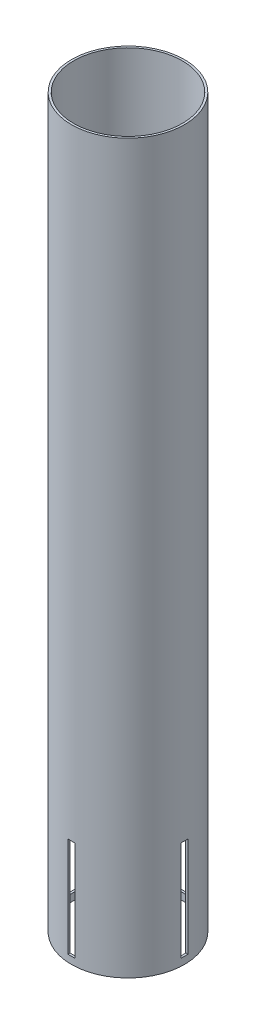
ISO-10303-21;
HEADER;
FILE_DESCRIPTION(('STEP AP214'),'2;1');
FILE_NAME('part.step','',(''),(''),'','','');
FILE_SCHEMA(('AUTOMOTIVE_DESIGN { 1 0 10303 214 1 1 1 1 }'));
ENDSEC;
DATA;
#1=APPLICATION_CONTEXT('core data for automotive mechanical design processes');
#2=APPLICATION_PROTOCOL_DEFINITION('international standard','automotive_design',2000,#1);
#3=PRODUCT_CONTEXT('',#1,'mechanical');
#4=PRODUCT('Part','Part','',(#3));
#5=PRODUCT_RELATED_PRODUCT_CATEGORY('part','',(#4));
#6=PRODUCT_DEFINITION_FORMATION('','',#4);
#7=PRODUCT_DEFINITION_CONTEXT('part definition',#1,'design');
#8=PRODUCT_DEFINITION('design','',#6,#7);
#9=PRODUCT_DEFINITION_SHAPE('','',#8);
#10=(LENGTH_UNIT() NAMED_UNIT(*) SI_UNIT(.MILLI.,.METRE.));
#11=(NAMED_UNIT(*) PLANE_ANGLE_UNIT() SI_UNIT($,.RADIAN.));
#12=(NAMED_UNIT(*) SI_UNIT($,.STERADIAN.) SOLID_ANGLE_UNIT());
#13=UNCERTAINTY_MEASURE_WITH_UNIT(LENGTH_MEASURE(1.E-05),#10,'distance_accuracy_value','');
#14=(GEOMETRIC_REPRESENTATION_CONTEXT(3) GLOBAL_UNCERTAINTY_ASSIGNED_CONTEXT((#13)) GLOBAL_UNIT_ASSIGNED_CONTEXT((#10,
#11,#12)) REPRESENTATION_CONTEXT('',''));
#15=CARTESIAN_POINT('',(0.,0.,0.));
#16=DIRECTION('',(0.,0.,1.));
#17=DIRECTION('',(1.,0.,0.));
#18=AXIS2_PLACEMENT_3D('',#15,#16,#17);
#19=CARTESIAN_POINT('',(0.,510.,0.));
#20=DIRECTION('',(0.,1.,0.));
#21=DIRECTION('',(0.,0.,1.));
#22=AXIS2_PLACEMENT_3D('',#19,#20,#21);
#23=PLANE('',#22);
#24=CARTESIAN_POINT('',(0.,510.,0.));
#25=DIRECTION('',(0.,1.,0.));
#26=DIRECTION('',(0.,0.,1.));
#27=AXIS2_PLACEMENT_3D('',#24,#25,#26);
#28=CIRCLE('',#27,39.6);
#29=CARTESIAN_POINT('',(0.,510.,39.6));
#30=VERTEX_POINT('',#29);
#31=EDGE_CURVE('E284',#30,#30,#28,.T.);
#32=ORIENTED_EDGE('',*,*,#31,.T.);
#33=EDGE_LOOP('',(#32));
#34=FACE_BOUND('',#33,.T.);
#35=CARTESIAN_POINT('',(0.,510.,0.));
#36=DIRECTION('',(0.,1.,0.));
#37=DIRECTION('',(0.,0.,1.));
#38=AXIS2_PLACEMENT_3D('',#35,#36,#37);
#39=CIRCLE('',#38,38.1);
#40=CARTESIAN_POINT('',(0.,510.,38.1));
#41=VERTEX_POINT('',#40);
#42=EDGE_CURVE('E278',#41,#41,#39,.T.);
#43=ORIENTED_EDGE('',*,*,#42,.F.);
#44=EDGE_LOOP('',(#43));
#45=FACE_BOUND('',#44,.T.);
#46=ADVANCED_FACE('F36',(#34,#45),#23,.T.);
#47=CARTESIAN_POINT('',(0.,0.,0.));
#48=DIRECTION('',(0.,1.,0.));
#49=DIRECTION('',(0.,0.,1.));
#50=AXIS2_PLACEMENT_3D('',#47,#48,#49);
#51=PLANE('',#50);
#52=CARTESIAN_POINT('',(0.,0.,0.));
#53=DIRECTION('',(0.,1.,0.));
#54=DIRECTION('',(0.,0.,1.));
#55=AXIS2_PLACEMENT_3D('',#52,#53,#54);
#56=CIRCLE('',#55,39.6);
#57=CARTESIAN_POINT('',(0.,0.,39.6));
#58=VERTEX_POINT('',#57);
#59=EDGE_CURVE('E281',#58,#58,#56,.T.);
#60=ORIENTED_EDGE('',*,*,#59,.F.);
#61=EDGE_LOOP('',(#60));
#62=FACE_BOUND('',#61,.T.);
#63=CARTESIAN_POINT('',(0.,0.,0.));
#64=DIRECTION('',(0.,1.,0.));
#65=DIRECTION('',(0.,0.,1.));
#66=AXIS2_PLACEMENT_3D('',#63,#64,#65);
#67=CIRCLE('',#66,38.1);
#68=CARTESIAN_POINT('',(0.,0.,38.1));
#69=VERTEX_POINT('',#68);
#70=EDGE_CURVE('E277',#69,#69,#67,.T.);
#71=ORIENTED_EDGE('',*,*,#70,.T.);
#72=EDGE_LOOP('',(#71));
#73=FACE_BOUND('',#72,.T.);
#74=ADVANCED_FACE('F327',(#62,#73),#51,.F.);
#75=CARTESIAN_POINT('',(0.,510.,0.));
#76=DIRECTION('',(0.,-1.,0.));
#77=DIRECTION('',(0.,0.,-1.));
#78=AXIS2_PLACEMENT_3D('',#75,#76,#77);
#79=CYLINDRICAL_SURFACE('',#78,39.6);
#80=DIRECTION('',(0.,-1.,0.));
#81=VECTOR('',#80,1.);
#82=CARTESIAN_POINT('',(-39.5210070721888,510.,2.50000000000014));
#83=LINE('',#82,#81);
#84=CARTESIAN_POINT('',(-39.5210070721888,75.,2.50000000000014));
#85=VERTEX_POINT('',#84);
#86=CARTESIAN_POINT('',(-39.5210070721888,5.,2.50000000000014));
#87=VERTEX_POINT('',#86);
#88=EDGE_CURVE('E227',#85,#87,#83,.T.);
#89=ORIENTED_EDGE('',*,*,#88,.T.);
#90=CARTESIAN_POINT('',(0.,5.,0.));
#91=DIRECTION('',(0.,-1.,0.));
#92=DIRECTION('',(0.,0.,-1.));
#93=AXIS2_PLACEMENT_3D('',#90,#91,#92);
#94=CIRCLE('',#93,39.6);
#95=CARTESIAN_POINT('',(-39.5210070721888,5.,-2.49999999999986));
#96=VERTEX_POINT('',#95);
#97=EDGE_CURVE('E51',#87,#96,#94,.T.);
#98=ORIENTED_EDGE('',*,*,#97,.T.);
#99=DIRECTION('',(0.,-1.,0.));
#100=VECTOR('',#99,1.);
#101=CARTESIAN_POINT('',(-39.5210070721888,510.,-2.49999999999986));
#102=LINE('',#101,#100);
#103=CARTESIAN_POINT('',(-39.5210070721888,75.,-2.49999999999986));
#104=VERTEX_POINT('',#103);
#105=EDGE_CURVE('E247',#96,#104,#102,.F.);
#106=ORIENTED_EDGE('',*,*,#105,.T.);
#107=CARTESIAN_POINT('',(0.,75.,0.));
#108=DIRECTION('',(0.,1.,0.));
#109=DIRECTION('',(0.,0.,1.));
#110=AXIS2_PLACEMENT_3D('',#107,#108,#109);
#111=CIRCLE('',#110,39.6);
#112=EDGE_CURVE('E216',#104,#85,#111,.T.);
#113=ORIENTED_EDGE('',*,*,#112,.T.);
#114=EDGE_LOOP('',(#89,#98,#106,#113));
#115=FACE_BOUND('',#114,.T.);
#116=CARTESIAN_POINT('',(-2.5,75.,39.5210070721888));
#117=VERTEX_POINT('',#116);
#118=CARTESIAN_POINT('',(2.5,75.,39.5210070721888));
#119=VERTEX_POINT('',#118);
#120=EDGE_CURVE('E253',#117,#119,#111,.T.);
#121=ORIENTED_EDGE('',*,*,#120,.T.);
#122=DIRECTION('',(0.,-1.,0.));
#123=VECTOR('',#122,1.);
#124=CARTESIAN_POINT('',(2.5,510.,39.5210070721888));
#125=LINE('',#124,#123);
#126=CARTESIAN_POINT('',(2.5,5.,39.5210070721888));
#127=VERTEX_POINT('',#126);
#128=EDGE_CURVE('E242',#119,#127,#125,.T.);
#129=ORIENTED_EDGE('',*,*,#128,.T.);
#130=CARTESIAN_POINT('',(-2.5,5.,39.5210070721888));
#131=VERTEX_POINT('',#130);
#132=EDGE_CURVE('E248',#127,#131,#94,.T.);
#133=ORIENTED_EDGE('',*,*,#132,.T.);
#134=DIRECTION('',(0.,-1.,0.));
#135=VECTOR('',#134,1.);
#136=CARTESIAN_POINT('',(-2.5,510.,39.5210070721888));
#137=LINE('',#136,#135);
#138=EDGE_CURVE('E230',#131,#117,#137,.F.);
#139=ORIENTED_EDGE('',*,*,#138,.T.);
#140=EDGE_LOOP('',(#121,#129,#133,#139));
#141=FACE_BOUND('',#140,.T.);
#142=DIRECTION('',(0.,-1.,0.));
#143=VECTOR('',#142,1.);
#144=CARTESIAN_POINT('',(39.5210070721888,510.,-2.50000000000014));
#145=LINE('',#144,#143);
#146=CARTESIAN_POINT('',(39.5210070721888,75.,-2.50000000000014));
#147=VERTEX_POINT('',#146);
#148=CARTESIAN_POINT('',(39.5210070721888,5.,-2.50000000000014));
#149=VERTEX_POINT('',#148);
#150=EDGE_CURVE('E250',#147,#149,#145,.T.);
#151=ORIENTED_EDGE('',*,*,#150,.T.);
#152=CARTESIAN_POINT('',(39.5210070721889,5.,2.49999999999959));
#153=VERTEX_POINT('',#152);
#154=EDGE_CURVE('E245',#149,#153,#94,.T.);
#155=ORIENTED_EDGE('',*,*,#154,.T.);
#156=DIRECTION('',(0.,-1.,0.));
#157=VECTOR('',#156,1.);
#158=CARTESIAN_POINT('',(39.5210070721889,510.,2.49999999999959));
#159=LINE('',#158,#157);
#160=CARTESIAN_POINT('',(39.5210070721889,75.,2.49999999999959));
#161=VERTEX_POINT('',#160);
#162=EDGE_CURVE('E228',#153,#161,#159,.F.);
#163=ORIENTED_EDGE('',*,*,#162,.T.);
#164=EDGE_CURVE('E170',#161,#147,#111,.T.);
#165=ORIENTED_EDGE('',*,*,#164,.T.);
#166=EDGE_LOOP('',(#151,#155,#163,#165));
#167=FACE_BOUND('',#166,.T.);
#168=DIRECTION('',(0.,-1.,0.));
#169=VECTOR('',#168,1.);
#170=CARTESIAN_POINT('',(2.5,510.,-39.5210070721888));
#171=LINE('',#170,#169);
#172=CARTESIAN_POINT('',(2.5,5.,-39.5210070721888));
#173=VERTEX_POINT('',#172);
#174=CARTESIAN_POINT('',(2.5,75.,-39.5210070721888));
#175=VERTEX_POINT('',#174);
#176=EDGE_CURVE('E269',#173,#175,#171,.F.);
#177=ORIENTED_EDGE('',*,*,#176,.T.);
#178=CARTESIAN_POINT('',(0.,75.,0.));
#179=DIRECTION('',(0.,1.,0.));
#180=DIRECTION('',(0.,0.,1.));
#181=AXIS2_PLACEMENT_3D('',#178,#179,#180);
#182=CIRCLE('',#181,39.6);
#183=CARTESIAN_POINT('',(-2.5,75.,-39.5210070721888));
#184=VERTEX_POINT('',#183);
#185=EDGE_CURVE('E272',#175,#184,#182,.T.);
#186=ORIENTED_EDGE('',*,*,#185,.T.);
#187=DIRECTION('',(0.,-1.,0.));
#188=VECTOR('',#187,1.);
#189=CARTESIAN_POINT('',(-2.5,510.,-39.5210070721888));
#190=LINE('',#189,#188);
#191=CARTESIAN_POINT('',(-2.5,5.,-39.5210070721888));
#192=VERTEX_POINT('',#191);
#193=EDGE_CURVE('E274',#184,#192,#190,.T.);
#194=ORIENTED_EDGE('',*,*,#193,.T.);
#195=CARTESIAN_POINT('',(0.,5.,0.));
#196=DIRECTION('',(0.,-1.,0.));
#197=DIRECTION('',(0.,0.,-1.));
#198=AXIS2_PLACEMENT_3D('',#195,#196,#197);
#199=CIRCLE('',#198,39.6);
#200=EDGE_CURVE('E260',#192,#173,#199,.T.);
#201=ORIENTED_EDGE('',*,*,#200,.T.);
#202=EDGE_LOOP('',(#177,#186,#194,#201));
#203=FACE_BOUND('',#202,.T.);
#204=ORIENTED_EDGE('',*,*,#31,.F.);
#205=EDGE_LOOP('',(#204));
#206=FACE_BOUND('',#205,.T.);
#207=ORIENTED_EDGE('',*,*,#59,.T.);
#208=EDGE_LOOP('',(#207));
#209=FACE_BOUND('',#208,.T.);
#210=ADVANCED_FACE('F38',(#115,#141,#167,#203,#206,#209),#79,.T.);
#211=CARTESIAN_POINT('',(0.,510.,0.));
#212=DIRECTION('',(0.,-1.,0.));
#213=DIRECTION('',(0.,0.,-1.));
#214=AXIS2_PLACEMENT_3D('',#211,#212,#213);
#215=CYLINDRICAL_SURFACE('',#214,38.1);
#216=DIRECTION('',(0.,-1.,0.));
#217=VECTOR('',#216,1.);
#218=CARTESIAN_POINT('',(-38.0178905253829,510.,2.50000000000014));
#219=LINE('',#218,#217);
#220=CARTESIAN_POINT('',(-38.0178905253829,75.,2.50000000000013));
#221=VERTEX_POINT('',#220);
#222=CARTESIAN_POINT('',(-38.0178905253829,5.,2.50000000000013));
#223=VERTEX_POINT('',#222);
#224=EDGE_CURVE('E11',#221,#223,#219,.T.);
#225=ORIENTED_EDGE('',*,*,#224,.F.);
#226=CARTESIAN_POINT('',(0.,75.,0.));
#227=DIRECTION('',(0.,1.,0.));
#228=DIRECTION('',(0.,0.,1.));
#229=AXIS2_PLACEMENT_3D('',#226,#227,#228);
#230=CIRCLE('',#229,38.1);
#231=CARTESIAN_POINT('',(-38.0178905253829,75.,-2.49999999999987));
#232=VERTEX_POINT('',#231);
#233=EDGE_CURVE('E44',#232,#221,#230,.T.);
#234=ORIENTED_EDGE('',*,*,#233,.F.);
#235=DIRECTION('',(0.,-1.,0.));
#236=VECTOR('',#235,1.);
#237=CARTESIAN_POINT('',(-38.0178905253829,510.,-2.49999999999987));
#238=LINE('',#237,#236);
#239=CARTESIAN_POINT('',(-38.0178905253829,5.,-2.49999999999987));
#240=VERTEX_POINT('',#239);
#241=EDGE_CURVE('E184',#240,#232,#238,.F.);
#242=ORIENTED_EDGE('',*,*,#241,.F.);
#243=CARTESIAN_POINT('',(0.,5.,0.));
#244=DIRECTION('',(0.,-1.,0.));
#245=DIRECTION('',(0.,0.,-1.));
#246=AXIS2_PLACEMENT_3D('',#243,#244,#245);
#247=CIRCLE('',#246,38.1);
#248=EDGE_CURVE('E190',#223,#240,#247,.T.);
#249=ORIENTED_EDGE('',*,*,#248,.F.);
#250=EDGE_LOOP('',(#225,#234,#242,#249));
#251=FACE_BOUND('',#250,.T.);
#252=DIRECTION('',(0.,-1.,0.));
#253=VECTOR('',#252,1.);
#254=CARTESIAN_POINT('',(2.5,510.,38.0178905253829));
#255=LINE('',#254,#253);
#256=CARTESIAN_POINT('',(2.5,75.,38.0178905253829));
#257=VERTEX_POINT('',#256);
#258=CARTESIAN_POINT('',(2.5,5.,38.0178905253829));
#259=VERTEX_POINT('',#258);
#260=EDGE_CURVE('E185',#257,#259,#255,.T.);
#261=ORIENTED_EDGE('',*,*,#260,.F.);
#262=CARTESIAN_POINT('',(-2.5,75.,38.0178905253829));
#263=VERTEX_POINT('',#262);
#264=EDGE_CURVE('E180',#263,#257,#230,.T.);
#265=ORIENTED_EDGE('',*,*,#264,.F.);
#266=DIRECTION('',(0.,-1.,0.));
#267=VECTOR('',#266,1.);
#268=CARTESIAN_POINT('',(-2.5,510.,38.0178905253829));
#269=LINE('',#268,#267);
#270=CARTESIAN_POINT('',(-2.5,5.,38.0178905253829));
#271=VERTEX_POINT('',#270);
#272=EDGE_CURVE('E178',#271,#263,#269,.F.);
#273=ORIENTED_EDGE('',*,*,#272,.F.);
#274=EDGE_CURVE('E181',#259,#271,#247,.T.);
#275=ORIENTED_EDGE('',*,*,#274,.F.);
#276=EDGE_LOOP('',(#261,#265,#273,#275));
#277=FACE_BOUND('',#276,.T.);
#278=CARTESIAN_POINT('',(38.0178905253829,75.,2.4999999999996));
#279=VERTEX_POINT('',#278);
#280=CARTESIAN_POINT('',(38.0178905253829,75.,-2.50000000000013));
#281=VERTEX_POINT('',#280);
#282=EDGE_CURVE('E168',#279,#281,#230,.T.);
#283=ORIENTED_EDGE('',*,*,#282,.F.);
#284=DIRECTION('',(0.,-1.,0.));
#285=VECTOR('',#284,1.);
#286=CARTESIAN_POINT('',(38.0178905253829,510.,2.49999999999961));
#287=LINE('',#286,#285);
#288=CARTESIAN_POINT('',(38.0178905253829,5.,2.49999999999961));
#289=VERTEX_POINT('',#288);
#290=EDGE_CURVE('E150',#289,#279,#287,.F.);
#291=ORIENTED_EDGE('',*,*,#290,.F.);
#292=CARTESIAN_POINT('',(38.0178905253829,5.,-2.50000000000013));
#293=VERTEX_POINT('',#292);
#294=EDGE_CURVE('E162',#293,#289,#247,.T.);
#295=ORIENTED_EDGE('',*,*,#294,.F.);
#296=DIRECTION('',(0.,-1.,0.));
#297=VECTOR('',#296,1.);
#298=CARTESIAN_POINT('',(38.0178905253829,510.,-2.50000000000014));
#299=LINE('',#298,#297);
#300=EDGE_CURVE('E177',#281,#293,#299,.T.);
#301=ORIENTED_EDGE('',*,*,#300,.F.);
#302=EDGE_LOOP('',(#283,#291,#295,#301));
#303=FACE_BOUND('',#302,.T.);
#304=DIRECTION('',(0.,-1.,0.));
#305=VECTOR('',#304,1.);
#306=CARTESIAN_POINT('',(-2.5,510.,-38.0178905253829));
#307=LINE('',#306,#305);
#308=CARTESIAN_POINT('',(-2.5,75.,-38.0178905253829));
#309=VERTEX_POINT('',#308);
#310=CARTESIAN_POINT('',(-2.5,5.,-38.0178905253829));
#311=VERTEX_POINT('',#310);
#312=EDGE_CURVE('E163',#309,#311,#307,.T.);
#313=ORIENTED_EDGE('',*,*,#312,.F.);
#314=CARTESIAN_POINT('',(0.,75.,0.));
#315=DIRECTION('',(0.,1.,0.));
#316=DIRECTION('',(0.,0.,1.));
#317=AXIS2_PLACEMENT_3D('',#314,#315,#316);
#318=CIRCLE('',#317,38.1);
#319=CARTESIAN_POINT('',(2.5,75.,-38.0178905253829));
#320=VERTEX_POINT('',#319);
#321=EDGE_CURVE('E293',#320,#309,#318,.T.);
#322=ORIENTED_EDGE('',*,*,#321,.F.);
#323=DIRECTION('',(0.,-1.,0.));
#324=VECTOR('',#323,1.);
#325=CARTESIAN_POINT('',(2.5,510.,-38.0178905253829));
#326=LINE('',#325,#324);
#327=CARTESIAN_POINT('',(2.5,5.,-38.0178905253829));
#328=VERTEX_POINT('',#327);
#329=EDGE_CURVE('E291',#328,#320,#326,.F.);
#330=ORIENTED_EDGE('',*,*,#329,.F.);
#331=CARTESIAN_POINT('',(0.,5.,0.));
#332=DIRECTION('',(0.,-1.,0.));
#333=DIRECTION('',(0.,0.,-1.));
#334=AXIS2_PLACEMENT_3D('',#331,#332,#333);
#335=CIRCLE('',#334,38.1);
#336=EDGE_CURVE('E287',#311,#328,#335,.T.);
#337=ORIENTED_EDGE('',*,*,#336,.F.);
#338=EDGE_LOOP('',(#313,#322,#330,#337));
#339=FACE_BOUND('',#338,.T.);
#340=ORIENTED_EDGE('',*,*,#42,.T.);
#341=EDGE_LOOP('',(#340));
#342=FACE_BOUND('',#341,.T.);
#343=ORIENTED_EDGE('',*,*,#70,.F.);
#344=EDGE_LOOP('',(#343));
#345=FACE_BOUND('',#344,.T.);
#346=ADVANCED_FACE('F175',(#251,#277,#303,#339,#342,#345),#215,.F.);
#347=CARTESIAN_POINT('',(-2.5,5.,-39.6));
#348=DIRECTION('',(-1.,0.,0.));
#349=DIRECTION('',(0.,-1.,0.));
#350=AXIS2_PLACEMENT_3D('',#347,#348,#349);
#351=PLANE('',#350);
#352=DIRECTION('',(0.,0.,1.));
#353=VECTOR('',#352,1.);
#354=CARTESIAN_POINT('',(-2.5,75.,-39.6));
#355=LINE('',#354,#353);
#356=EDGE_CURVE('E257',#184,#309,#355,.T.);
#357=ORIENTED_EDGE('',*,*,#356,.T.);
#358=ORIENTED_EDGE('',*,*,#312,.T.);
#359=DIRECTION('',(0.,0.,1.));
#360=VECTOR('',#359,1.);
#361=CARTESIAN_POINT('',(-2.5,5.,-39.6));
#362=LINE('',#361,#360);
#363=EDGE_CURVE('E256',#192,#311,#362,.T.);
#364=ORIENTED_EDGE('',*,*,#363,.F.);
#365=ORIENTED_EDGE('',*,*,#193,.F.);
#366=EDGE_LOOP('',(#357,#358,#364,#365));
#367=FACE_BOUND('',#366,.T.);
#368=ADVANCED_FACE('F300',(#367),#351,.F.);
#369=CARTESIAN_POINT('',(-2.5,75.,-39.6));
#370=DIRECTION('',(0.,1.,0.));
#371=DIRECTION('',(0.,0.,1.));
#372=AXIS2_PLACEMENT_3D('',#369,#370,#371);
#373=PLANE('',#372);
#374=DIRECTION('',(0.,0.,1.));
#375=VECTOR('',#374,1.);
#376=CARTESIAN_POINT('',(2.5,75.,-39.6));
#377=LINE('',#376,#375);
#378=EDGE_CURVE('E261',#175,#320,#377,.T.);
#379=ORIENTED_EDGE('',*,*,#378,.T.);
#380=ORIENTED_EDGE('',*,*,#321,.T.);
#381=ORIENTED_EDGE('',*,*,#356,.F.);
#382=ORIENTED_EDGE('',*,*,#185,.F.);
#383=EDGE_LOOP('',(#379,#380,#381,#382));
#384=FACE_BOUND('',#383,.T.);
#385=ADVANCED_FACE('F316',(#384),#373,.F.);
#386=CARTESIAN_POINT('',(2.5,5.,-39.6));
#387=DIRECTION('',(1.,0.,0.));
#388=DIRECTION('',(0.,1.,0.));
#389=AXIS2_PLACEMENT_3D('',#386,#387,#388);
#390=PLANE('',#389);
#391=DIRECTION('',(0.,0.,1.));
#392=VECTOR('',#391,1.);
#393=CARTESIAN_POINT('',(2.5,5.,-39.6));
#394=LINE('',#393,#392);
#395=EDGE_CURVE('E264',#173,#328,#394,.T.);
#396=ORIENTED_EDGE('',*,*,#395,.T.);
#397=ORIENTED_EDGE('',*,*,#329,.T.);
#398=ORIENTED_EDGE('',*,*,#378,.F.);
#399=ORIENTED_EDGE('',*,*,#176,.F.);
#400=EDGE_LOOP('',(#396,#397,#398,#399));
#401=FACE_BOUND('',#400,.T.);
#402=ADVANCED_FACE('F311',(#401),#390,.F.);
#403=CARTESIAN_POINT('',(-2.5,5.,-39.6));
#404=DIRECTION('',(0.,-1.,0.));
#405=DIRECTION('',(0.,0.,-1.));
#406=AXIS2_PLACEMENT_3D('',#403,#404,#405);
#407=PLANE('',#406);
#408=ORIENTED_EDGE('',*,*,#200,.F.);
#409=ORIENTED_EDGE('',*,*,#363,.T.);
#410=ORIENTED_EDGE('',*,*,#336,.T.);
#411=ORIENTED_EDGE('',*,*,#395,.F.);
#412=EDGE_LOOP('',(#408,#409,#410,#411));
#413=FACE_BOUND('',#412,.T.);
#414=ADVANCED_FACE('F308',(#413),#407,.F.);
#415=CARTESIAN_POINT('',(39.6000000000004,5.,2.49999999999959));
#416=DIRECTION('',(0.,0.,1.));
#417=DIRECTION('',(1.,0.,0.));
#418=AXIS2_PLACEMENT_3D('',#415,#416,#417);
#419=PLANE('',#418);
#420=DIRECTION('',(-1.,0.,0.));
#421=VECTOR('',#420,1.);
#422=CARTESIAN_POINT('',(39.6000000000004,5.,2.49999999999959));
#423=LINE('',#422,#421);
#424=EDGE_CURVE('E157',#153,#289,#423,.T.);
#425=ORIENTED_EDGE('',*,*,#424,.T.);
#426=ORIENTED_EDGE('',*,*,#290,.T.);
#427=DIRECTION('',(-1.,0.,0.));
#428=VECTOR('',#427,1.);
#429=CARTESIAN_POINT('',(39.6000000000004,75.,2.49999999999959));
#430=LINE('',#429,#428);
#431=EDGE_CURVE('E154',#161,#279,#430,.T.);
#432=ORIENTED_EDGE('',*,*,#431,.F.);
#433=ORIENTED_EDGE('',*,*,#162,.F.);
#434=EDGE_LOOP('',(#425,#426,#432,#433));
#435=FACE_BOUND('',#434,.T.);
#436=ADVANCED_FACE('F152',(#435),#419,.F.);
#437=CARTESIAN_POINT('',(-39.6000000000001,5.,2.50000000000014));
#438=DIRECTION('',(0.,-1.,0.));
#439=DIRECTION('',(0.,0.,-1.));
#440=AXIS2_PLACEMENT_3D('',#437,#438,#439);
#441=PLANE('',#440);
#442=DIRECTION('',(1.,0.,0.));
#443=VECTOR('',#442,1.);
#444=CARTESIAN_POINT('',(-39.6000000000002,5.,-2.49999999999986));
#445=LINE('',#444,#443);
#446=EDGE_CURVE('E235',#293,#149,#445,.T.);
#447=ORIENTED_EDGE('',*,*,#446,.F.);
#448=ORIENTED_EDGE('',*,*,#294,.T.);
#449=ORIENTED_EDGE('',*,*,#424,.F.);
#450=ORIENTED_EDGE('',*,*,#154,.F.);
#451=EDGE_LOOP('',(#447,#448,#449,#450));
#452=FACE_BOUND('',#451,.T.);
#453=ADVANCED_FACE('F342',(#452),#441,.F.);
#454=CARTESIAN_POINT('',(-39.6000000000002,5.,-2.49999999999986));
#455=DIRECTION('',(0.,0.,-1.));
#456=DIRECTION('',(-1.,0.,0.));
#457=AXIS2_PLACEMENT_3D('',#454,#455,#456);
#458=PLANE('',#457);
#459=DIRECTION('',(1.,0.,0.));
#460=VECTOR('',#459,1.);
#461=CARTESIAN_POINT('',(-39.6000000000002,75.,-2.49999999999986));
#462=LINE('',#461,#460);
#463=EDGE_CURVE('E218',#281,#147,#462,.T.);
#464=ORIENTED_EDGE('',*,*,#463,.F.);
#465=ORIENTED_EDGE('',*,*,#300,.T.);
#466=ORIENTED_EDGE('',*,*,#446,.T.);
#467=ORIENTED_EDGE('',*,*,#150,.F.);
#468=EDGE_LOOP('',(#464,#465,#466,#467));
#469=FACE_BOUND('',#468,.T.);
#470=ADVANCED_FACE('F347',(#469),#458,.F.);
#471=CARTESIAN_POINT('',(-39.6000000000001,75.,2.50000000000014));
#472=DIRECTION('',(0.,1.,0.));
#473=DIRECTION('',(0.,0.,1.));
#474=AXIS2_PLACEMENT_3D('',#471,#472,#473);
#475=PLANE('',#474);
#476=ORIENTED_EDGE('',*,*,#431,.T.);
#477=ORIENTED_EDGE('',*,*,#282,.T.);
#478=ORIENTED_EDGE('',*,*,#463,.T.);
#479=ORIENTED_EDGE('',*,*,#164,.F.);
#480=EDGE_LOOP('',(#476,#477,#478,#479));
#481=FACE_BOUND('',#480,.T.);
#482=ADVANCED_FACE('F166',(#481),#475,.F.);
#483=CARTESIAN_POINT('',(-2.5,5.,39.6));
#484=DIRECTION('',(-1.,0.,0.));
#485=DIRECTION('',(0.,-1.,0.));
#486=AXIS2_PLACEMENT_3D('',#483,#484,#485);
#487=PLANE('',#486);
#488=DIRECTION('',(0.,0.,-1.));
#489=VECTOR('',#488,1.);
#490=CARTESIAN_POINT('',(-2.5,5.,39.6));
#491=LINE('',#490,#489);
#492=EDGE_CURVE('E376',#131,#271,#491,.T.);
#493=ORIENTED_EDGE('',*,*,#492,.T.);
#494=ORIENTED_EDGE('',*,*,#272,.T.);
#495=DIRECTION('',(0.,0.,-1.));
#496=VECTOR('',#495,1.);
#497=CARTESIAN_POINT('',(-2.5,75.,39.6));
#498=LINE('',#497,#496);
#499=EDGE_CURVE('E59',#117,#263,#498,.T.);
#500=ORIENTED_EDGE('',*,*,#499,.F.);
#501=ORIENTED_EDGE('',*,*,#138,.F.);
#502=EDGE_LOOP('',(#493,#494,#500,#501));
#503=FACE_BOUND('',#502,.T.);
#504=ADVANCED_FACE('F353',(#503),#487,.F.);
#505=CARTESIAN_POINT('',(2.5,5.,39.6));
#506=DIRECTION('',(1.,0.,0.));
#507=DIRECTION('',(0.,1.,0.));
#508=AXIS2_PLACEMENT_3D('',#505,#506,#507);
#509=PLANE('',#508);
#510=DIRECTION('',(0.,0.,-1.));
#511=VECTOR('',#510,1.);
#512=CARTESIAN_POINT('',(2.5,75.,39.6));
#513=LINE('',#512,#511);
#514=EDGE_CURVE('E238',#119,#257,#513,.T.);
#515=ORIENTED_EDGE('',*,*,#514,.T.);
#516=ORIENTED_EDGE('',*,*,#260,.T.);
#517=DIRECTION('',(0.,0.,-1.));
#518=VECTOR('',#517,1.);
#519=CARTESIAN_POINT('',(2.5,5.,39.6));
#520=LINE('',#519,#518);
#521=EDGE_CURVE('E172',#127,#259,#520,.T.);
#522=ORIENTED_EDGE('',*,*,#521,.F.);
#523=ORIENTED_EDGE('',*,*,#128,.F.);
#524=EDGE_LOOP('',(#515,#516,#522,#523));
#525=FACE_BOUND('',#524,.T.);
#526=ADVANCED_FACE('F356',(#525),#509,.F.);
#527=ORIENTED_EDGE('',*,*,#521,.T.);
#528=ORIENTED_EDGE('',*,*,#274,.T.);
#529=ORIENTED_EDGE('',*,*,#492,.F.);
#530=ORIENTED_EDGE('',*,*,#132,.F.);
#531=EDGE_LOOP('',(#527,#528,#529,#530));
#532=FACE_BOUND('',#531,.T.);
#533=ADVANCED_FACE('F350',(#532),#441,.F.);
#534=ORIENTED_EDGE('',*,*,#120,.F.);
#535=ORIENTED_EDGE('',*,*,#499,.T.);
#536=ORIENTED_EDGE('',*,*,#264,.T.);
#537=ORIENTED_EDGE('',*,*,#514,.F.);
#538=EDGE_LOOP('',(#534,#535,#536,#537));
#539=FACE_BOUND('',#538,.T.);
#540=ADVANCED_FACE('F362',(#539),#475,.F.);
#541=CARTESIAN_POINT('',(-39.6000000000001,5.,2.50000000000014));
#542=DIRECTION('',(0.,0.,1.));
#543=DIRECTION('',(1.,0.,0.));
#544=AXIS2_PLACEMENT_3D('',#541,#542,#543);
#545=PLANE('',#544);
#546=DIRECTION('',(1.,0.,0.));
#547=VECTOR('',#546,1.);
#548=CARTESIAN_POINT('',(-39.6000000000001,75.,2.50000000000014));
#549=LINE('',#548,#547);
#550=EDGE_CURVE('E217',#85,#221,#549,.T.);
#551=ORIENTED_EDGE('',*,*,#550,.T.);
#552=ORIENTED_EDGE('',*,*,#224,.T.);
#553=DIRECTION('',(1.,0.,0.));
#554=VECTOR('',#553,1.);
#555=CARTESIAN_POINT('',(-39.6000000000001,5.,2.50000000000014));
#556=LINE('',#555,#554);
#557=EDGE_CURVE('E226',#87,#223,#556,.T.);
#558=ORIENTED_EDGE('',*,*,#557,.F.);
#559=ORIENTED_EDGE('',*,*,#88,.F.);
#560=EDGE_LOOP('',(#551,#552,#558,#559));
#561=FACE_BOUND('',#560,.T.);
#562=ADVANCED_FACE('F224',(#561),#545,.F.);
#563=EDGE_CURVE('E208',#104,#232,#462,.T.);
#564=ORIENTED_EDGE('',*,*,#563,.T.);
#565=ORIENTED_EDGE('',*,*,#233,.T.);
#566=ORIENTED_EDGE('',*,*,#550,.F.);
#567=ORIENTED_EDGE('',*,*,#112,.F.);
#568=EDGE_LOOP('',(#564,#565,#566,#567));
#569=FACE_BOUND('',#568,.T.);
#570=ADVANCED_FACE('F213',(#569),#475,.F.);
#571=EDGE_CURVE('E209',#96,#240,#445,.T.);
#572=ORIENTED_EDGE('',*,*,#571,.T.);
#573=ORIENTED_EDGE('',*,*,#241,.T.);
#574=ORIENTED_EDGE('',*,*,#563,.F.);
#575=ORIENTED_EDGE('',*,*,#105,.F.);
#576=EDGE_LOOP('',(#572,#573,#574,#575));
#577=FACE_BOUND('',#576,.T.);
#578=ADVANCED_FACE('F206',(#577),#458,.F.);
#579=ORIENTED_EDGE('',*,*,#557,.T.);
#580=ORIENTED_EDGE('',*,*,#248,.T.);
#581=ORIENTED_EDGE('',*,*,#571,.F.);
#582=ORIENTED_EDGE('',*,*,#97,.F.);
#583=EDGE_LOOP('',(#579,#580,#581,#582));
#584=FACE_BOUND('',#583,.T.);
#585=ADVANCED_FACE('F351',(#584),#441,.F.);
#586=CLOSED_SHELL('',(#46,#74,#210,#346,#368,#385,#402,#414,#436,#453,#470,#482,#504,#526,#533,
#540,#562,#570,#578,#585));
#587=MANIFOLD_SOLID_BREP('B2',#586);
#588=ADVANCED_BREP_SHAPE_REPRESENTATION('',(#18,#587),#14);
#589=SHAPE_DEFINITION_REPRESENTATION(#9,#588);
ENDSEC;
END-ISO-10303-21;
